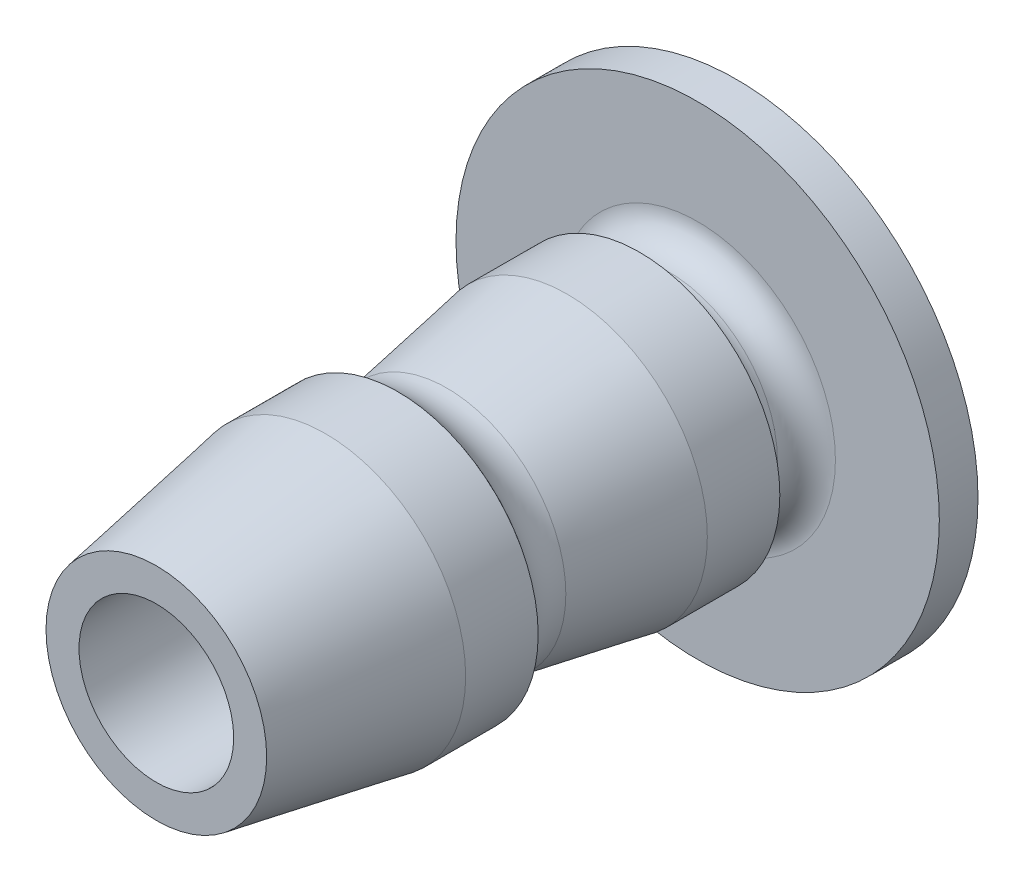
ISO-10303-21;
HEADER;
FILE_DESCRIPTION(('STEP AP214'),'2;1');
FILE_NAME('part.step','',(''),(''),'','','');
FILE_SCHEMA(('AUTOMOTIVE_DESIGN { 1 0 10303 214 1 1 1 1 }'));
ENDSEC;
DATA;
#1=APPLICATION_CONTEXT('core data for automotive mechanical design processes');
#2=APPLICATION_PROTOCOL_DEFINITION('international standard','automotive_design',2000,#1);
#3=PRODUCT_CONTEXT('',#1,'mechanical');
#4=PRODUCT('Part','Part','',(#3));
#5=PRODUCT_RELATED_PRODUCT_CATEGORY('part','',(#4));
#6=PRODUCT_DEFINITION_FORMATION('','',#4);
#7=PRODUCT_DEFINITION_CONTEXT('part definition',#1,'design');
#8=PRODUCT_DEFINITION('design','',#6,#7);
#9=PRODUCT_DEFINITION_SHAPE('','',#8);
#10=(LENGTH_UNIT() NAMED_UNIT(*) SI_UNIT(.MILLI.,.METRE.));
#11=(NAMED_UNIT(*) PLANE_ANGLE_UNIT() SI_UNIT($,.RADIAN.));
#12=(NAMED_UNIT(*) SI_UNIT($,.STERADIAN.) SOLID_ANGLE_UNIT());
#13=UNCERTAINTY_MEASURE_WITH_UNIT(LENGTH_MEASURE(1.E-05),#10,'distance_accuracy_value','');
#14=(GEOMETRIC_REPRESENTATION_CONTEXT(3) GLOBAL_UNCERTAINTY_ASSIGNED_CONTEXT((#13)) GLOBAL_UNIT_ASSIGNED_CONTEXT((#10,
#11,#12)) REPRESENTATION_CONTEXT('',''));
#15=CARTESIAN_POINT('',(0.,0.,0.));
#16=DIRECTION('',(0.,0.,1.));
#17=DIRECTION('',(1.,0.,0.));
#18=AXIS2_PLACEMENT_3D('',#15,#16,#17);
#19=CARTESIAN_POINT('',(0.,0.,0.));
#20=DIRECTION('',(0.,0.,1.));
#21=DIRECTION('',(1.,0.,0.));
#22=AXIS2_PLACEMENT_3D('',#19,#20,#21);
#23=PLANE('',#22);
#24=CARTESIAN_POINT('',(0.,0.,0.));
#25=DIRECTION('',(0.,0.,1.));
#26=DIRECTION('',(1.,0.,0.));
#27=AXIS2_PLACEMENT_3D('',#24,#25,#26);
#28=CIRCLE('',#27,2.85);
#29=CARTESIAN_POINT('',(2.85,0.,0.));
#30=VERTEX_POINT('',#29);
#31=EDGE_CURVE('E46',#30,#30,#28,.T.);
#32=ORIENTED_EDGE('',*,*,#31,.T.);
#33=EDGE_LOOP('',(#32));
#34=FACE_BOUND('',#33,.T.);
#35=CARTESIAN_POINT('',(0.,0.,0.));
#36=DIRECTION('',(0.,0.,1.));
#37=DIRECTION('',(1.,0.,0.));
#38=AXIS2_PLACEMENT_3D('',#35,#36,#37);
#39=CIRCLE('',#38,2.9);
#40=CARTESIAN_POINT('',(2.9,0.,0.));
#41=VERTEX_POINT('',#40);
#42=EDGE_CURVE('E67',#41,#41,#39,.T.);
#43=ORIENTED_EDGE('',*,*,#42,.F.);
#44=EDGE_LOOP('',(#43));
#45=FACE_BOUND('',#44,.T.);
#46=ADVANCED_FACE('F31',(#34,#45),#23,.F.);
#47=CARTESIAN_POINT('',(0.,0.,5.));
#48=DIRECTION('',(0.,0.,-1.));
#49=DIRECTION('',(-1.,0.,0.));
#50=AXIS2_PLACEMENT_3D('',#47,#48,#49);
#51=CYLINDRICAL_SURFACE('',#50,2.9);
#52=CARTESIAN_POINT('',(0.,0.,1.49999999999993));
#53=DIRECTION('',(0.,0.,1.));
#54=DIRECTION('',(1.,0.,0.));
#55=AXIS2_PLACEMENT_3D('',#52,#53,#54);
#56=CIRCLE('',#55,2.9);
#57=CARTESIAN_POINT('',(2.9,0.,1.49999999999993));
#58=VERTEX_POINT('',#57);
#59=EDGE_CURVE('E64',#58,#58,#56,.F.);
#60=ORIENTED_EDGE('',*,*,#59,.T.);
#61=EDGE_LOOP('',(#60));
#62=FACE_BOUND('',#61,.T.);
#63=ORIENTED_EDGE('',*,*,#42,.T.);
#64=EDGE_LOOP('',(#63));
#65=FACE_BOUND('',#64,.T.);
#66=ADVANCED_FACE('F106',(#62,#65),#51,.T.);
#67=CARTESIAN_POINT('',(0.,0.,5.));
#68=DIRECTION('',(0.,0.,-1.));
#69=DIRECTION('',(-1.,0.,0.));
#70=AXIS2_PLACEMENT_3D('',#67,#68,#69);
#71=CYLINDRICAL_SURFACE('',#70,1.6);
#72=CARTESIAN_POINT('',(0.,0.,-1.));
#73=DIRECTION('',(0.,0.,1.));
#74=DIRECTION('',(1.,0.,0.));
#75=AXIS2_PLACEMENT_3D('',#72,#73,#74);
#76=CIRCLE('',#75,1.6);
#77=CARTESIAN_POINT('',(1.6,0.,-1.));
#78=VERTEX_POINT('',#77);
#79=EDGE_CURVE('E10',#78,#78,#76,.F.);
#80=ORIENTED_EDGE('',*,*,#79,.T.);
#81=EDGE_LOOP('',(#80));
#82=FACE_BOUND('',#81,.T.);
#83=CARTESIAN_POINT('',(0.,0.,10.));
#84=DIRECTION('',(0.,0.,1.));
#85=DIRECTION('',(1.,0.,0.));
#86=AXIS2_PLACEMENT_3D('',#83,#84,#85);
#87=CIRCLE('',#86,1.6);
#88=CARTESIAN_POINT('',(1.6,0.,10.));
#89=VERTEX_POINT('',#88);
#90=EDGE_CURVE('E73',#89,#89,#87,.T.);
#91=ORIENTED_EDGE('',*,*,#90,.T.);
#92=EDGE_LOOP('',(#91));
#93=FACE_BOUND('',#92,.T.);
#94=ADVANCED_FACE('F112',(#82,#93),#71,.F.);
#95=CARTESIAN_POINT('',(0.,0.,5.));
#96=DIRECTION('',(0.,0.,-1.));
#97=DIRECTION('',(-1.,0.,0.));
#98=AXIS2_PLACEMENT_3D('',#95,#96,#97);
#99=CONICAL_SURFACE('',#98,2.28285556752037,0.17453292519943);
#100=CARTESIAN_POINT('',(0.,0.,3.98857033542322));
#101=DIRECTION('',(0.,0.,-1.));
#102=DIRECTION('',(-1.,0.,0.));
#103=AXIS2_PLACEMENT_3D('',#100,#101,#102);
#104=CIRCLE('',#103,2.46119790647417);
#105=CARTESIAN_POINT('',(-2.46119790647417,0.,3.98857033542322));
#106=VERTEX_POINT('',#105);
#107=EDGE_CURVE('E55',#106,#106,#104,.T.);
#108=ORIENTED_EDGE('',*,*,#107,.T.);
#109=EDGE_LOOP('',(#108));
#110=FACE_BOUND('',#109,.T.);
#111=ORIENTED_EDGE('',*,*,#59,.F.);
#112=EDGE_LOOP('',(#111));
#113=FACE_BOUND('',#112,.T.);
#114=ADVANCED_FACE('F119',(#110,#113),#99,.T.);
#115=CARTESIAN_POINT('',(0.,0.,10.));
#116=DIRECTION('',(0.,0.,1.));
#117=DIRECTION('',(1.,0.,0.));
#118=AXIS2_PLACEMENT_3D('',#115,#116,#117);
#119=PLANE('',#118);
#120=CARTESIAN_POINT('',(0.,0.,10.));
#121=DIRECTION('',(0.,0.,1.));
#122=DIRECTION('',(1.,0.,0.));
#123=AXIS2_PLACEMENT_3D('',#120,#121,#122);
#124=CIRCLE('',#123,2.28285556752038);
#125=CARTESIAN_POINT('',(2.28285556752038,0.,10.));
#126=VERTEX_POINT('',#125);
#127=EDGE_CURVE('E61',#126,#126,#124,.T.);
#128=ORIENTED_EDGE('',*,*,#127,.T.);
#129=EDGE_LOOP('',(#128));
#130=FACE_BOUND('',#129,.T.);
#131=ORIENTED_EDGE('',*,*,#90,.F.);
#132=EDGE_LOOP('',(#131));
#133=FACE_BOUND('',#132,.T.);
#134=ADVANCED_FACE('F122',(#130,#133),#119,.T.);
#135=CARTESIAN_POINT('',(0.,0.,10.));
#136=DIRECTION('',(0.,0.,-1.));
#137=DIRECTION('',(-1.,0.,0.));
#138=AXIS2_PLACEMENT_3D('',#135,#136,#137);
#139=CYLINDRICAL_SURFACE('',#138,2.9);
#140=CARTESIAN_POINT('',(0.,0.,6.49999999999997));
#141=DIRECTION('',(0.,0.,1.));
#142=DIRECTION('',(1.,0.,0.));
#143=AXIS2_PLACEMENT_3D('',#140,#141,#142);
#144=CIRCLE('',#143,2.9);
#145=CARTESIAN_POINT('',(2.9,0.,6.49999999999997));
#146=VERTEX_POINT('',#145);
#147=EDGE_CURVE('E58',#146,#146,#144,.F.);
#148=ORIENTED_EDGE('',*,*,#147,.T.);
#149=EDGE_LOOP('',(#148));
#150=FACE_BOUND('',#149,.T.);
#151=CARTESIAN_POINT('',(0.,0.,5.));
#152=DIRECTION('',(0.,0.,1.));
#153=DIRECTION('',(1.,0.,0.));
#154=AXIS2_PLACEMENT_3D('',#151,#152,#153);
#155=CIRCLE('',#154,2.9);
#156=CARTESIAN_POINT('',(2.9,0.,5.));
#157=VERTEX_POINT('',#156);
#158=EDGE_CURVE('E70',#157,#157,#155,.T.);
#159=ORIENTED_EDGE('',*,*,#158,.T.);
#160=EDGE_LOOP('',(#159));
#161=FACE_BOUND('',#160,.T.);
#162=ADVANCED_FACE('F125',(#150,#161),#139,.T.);
#163=CARTESIAN_POINT('',(0.,0.,10.));
#164=DIRECTION('',(0.,0.,-1.));
#165=DIRECTION('',(-1.,0.,0.));
#166=AXIS2_PLACEMENT_3D('',#163,#164,#165);
#167=CONICAL_SURFACE('',#166,2.28285556752038,0.17453292519943);
#168=ORIENTED_EDGE('',*,*,#147,.F.);
#169=EDGE_LOOP('',(#168));
#170=FACE_BOUND('',#169,.T.);
#171=ORIENTED_EDGE('',*,*,#127,.F.);
#172=EDGE_LOOP('',(#171));
#173=FACE_BOUND('',#172,.T.);
#174=ADVANCED_FACE('F101',(#170,#173),#167,.T.);
#175=CARTESIAN_POINT('',(0.,0.,4.16221851309015));
#176=DIRECTION('',(0.,0.,1.));
#177=DIRECTION('',(1.,0.,0.));
#178=AXIS2_PLACEMENT_3D('',#175,#176,#177);
#179=TOROIDAL_SURFACE('',#178,3.44600565948637,1.);
#180=ORIENTED_EDGE('',*,*,#107,.F.);
#181=EDGE_LOOP('',(#180));
#182=FACE_BOUND('',#181,.T.);
#183=ORIENTED_EDGE('',*,*,#158,.F.);
#184=EDGE_LOOP('',(#183));
#185=FACE_BOUND('',#184,.T.);
#186=ADVANCED_FACE('F93',(#182,#185),#179,.F.);
#187=CARTESIAN_POINT('',(0.,0.,-2.));
#188=DIRECTION('',(0.,0.,1.));
#189=DIRECTION('',(1.,0.,0.));
#190=AXIS2_PLACEMENT_3D('',#187,#188,#189);
#191=PLANE('',#190);
#192=CARTESIAN_POINT('',(0.,0.,-2.));
#193=DIRECTION('',(0.,0.,1.));
#194=DIRECTION('',(1.,0.,0.));
#195=AXIS2_PLACEMENT_3D('',#192,#193,#194);
#196=CIRCLE('',#195,2.6);
#197=CARTESIAN_POINT('',(2.6,0.,-2.));
#198=VERTEX_POINT('',#197);
#199=EDGE_CURVE('E38',#198,#198,#196,.T.);
#200=ORIENTED_EDGE('',*,*,#199,.T.);
#201=EDGE_LOOP('',(#200));
#202=FACE_BOUND('',#201,.T.);
#203=CARTESIAN_POINT('',(0.,0.,-2.));
#204=DIRECTION('',(0.,0.,1.));
#205=DIRECTION('',(1.,0.,0.));
#206=AXIS2_PLACEMENT_3D('',#203,#204,#205);
#207=CIRCLE('',#206,5.);
#208=CARTESIAN_POINT('',(5.,0.,-2.));
#209=VERTEX_POINT('',#208);
#210=EDGE_CURVE('E51',#209,#209,#207,.T.);
#211=ORIENTED_EDGE('',*,*,#210,.F.);
#212=EDGE_LOOP('',(#211));
#213=FACE_BOUND('',#212,.T.);
#214=ADVANCED_FACE('F91',(#202,#213),#191,.F.);
#215=CARTESIAN_POINT('',(0.,0.,-1.2));
#216=DIRECTION('',(0.,0.,1.));
#217=DIRECTION('',(1.,0.,0.));
#218=AXIS2_PLACEMENT_3D('',#215,#216,#217);
#219=PLANE('',#218);
#220=CARTESIAN_POINT('',(0.,0.,-1.2));
#221=DIRECTION('',(0.,0.,1.));
#222=DIRECTION('',(1.,0.,0.));
#223=AXIS2_PLACEMENT_3D('',#220,#221,#222);
#224=CIRCLE('',#223,2.85);
#225=CARTESIAN_POINT('',(2.85,0.,-1.2));
#226=VERTEX_POINT('',#225);
#227=EDGE_CURVE('E42',#226,#226,#224,.F.);
#228=ORIENTED_EDGE('',*,*,#227,.T.);
#229=EDGE_LOOP('',(#228));
#230=FACE_BOUND('',#229,.T.);
#231=CARTESIAN_POINT('',(0.,0.,-1.2));
#232=DIRECTION('',(0.,0.,1.));
#233=DIRECTION('',(1.,0.,0.));
#234=AXIS2_PLACEMENT_3D('',#231,#232,#233);
#235=CIRCLE('',#234,5.);
#236=CARTESIAN_POINT('',(5.,0.,-1.2));
#237=VERTEX_POINT('',#236);
#238=EDGE_CURVE('E76',#237,#237,#235,.T.);
#239=ORIENTED_EDGE('',*,*,#238,.T.);
#240=EDGE_LOOP('',(#239));
#241=FACE_BOUND('',#240,.T.);
#242=ADVANCED_FACE('F82',(#230,#241),#219,.T.);
#243=CARTESIAN_POINT('',(0.,0.,-1.2));
#244=DIRECTION('',(0.,0.,-1.));
#245=DIRECTION('',(-1.,0.,0.));
#246=AXIS2_PLACEMENT_3D('',#243,#244,#245);
#247=CYLINDRICAL_SURFACE('',#246,5.);
#248=ORIENTED_EDGE('',*,*,#238,.F.);
#249=EDGE_LOOP('',(#248));
#250=FACE_BOUND('',#249,.T.);
#251=ORIENTED_EDGE('',*,*,#210,.T.);
#252=EDGE_LOOP('',(#251));
#253=FACE_BOUND('',#252,.T.);
#254=ADVANCED_FACE('F84',(#250,#253),#247,.T.);
#255=CARTESIAN_POINT('',(0.,0.,-0.6));
#256=DIRECTION('',(0.,0.,1.));
#257=DIRECTION('',(1.,0.,0.));
#258=AXIS2_PLACEMENT_3D('',#255,#256,#257);
#259=TOROIDAL_SURFACE('',#258,2.85,0.6);
#260=ORIENTED_EDGE('',*,*,#227,.F.);
#261=EDGE_LOOP('',(#260));
#262=FACE_BOUND('',#261,.T.);
#263=CARTESIAN_POINT('',(0.,0.,-0.6));
#264=DIRECTION('',(0.,0.,1.));
#265=DIRECTION('',(1.,0.,0.));
#266=AXIS2_PLACEMENT_3D('',#263,#264,#265);
#267=CIRCLE('',#266,2.25);
#268=CARTESIAN_POINT('',(2.25,0.,-0.6));
#269=VERTEX_POINT('',#268);
#270=EDGE_CURVE('E49',#269,#269,#267,.T.);
#271=ORIENTED_EDGE('',*,*,#270,.F.);
#272=EDGE_LOOP('',(#271));
#273=FACE_BOUND('',#272,.T.);
#274=ADVANCED_FACE('F87',(#262,#273),#259,.F.);
#275=CARTESIAN_POINT('',(0.,0.,-0.6));
#276=DIRECTION('',(0.,0.,1.));
#277=DIRECTION('',(1.,0.,0.));
#278=AXIS2_PLACEMENT_3D('',#275,#276,#277);
#279=TOROIDAL_SURFACE('',#278,2.85,0.6);
#280=ORIENTED_EDGE('',*,*,#270,.T.);
#281=EDGE_LOOP('',(#280));
#282=FACE_BOUND('',#281,.T.);
#283=ORIENTED_EDGE('',*,*,#31,.F.);
#284=EDGE_LOOP('',(#283));
#285=FACE_BOUND('',#284,.T.);
#286=ADVANCED_FACE('F128',(#282,#285),#279,.F.);
#287=CARTESIAN_POINT('',(0.,0.,-1.));
#288=DIRECTION('',(0.,0.,1.));
#289=DIRECTION('',(1.,0.,0.));
#290=AXIS2_PLACEMENT_3D('',#287,#288,#289);
#291=TOROIDAL_SURFACE('',#290,2.6,1.);
#292=ORIENTED_EDGE('',*,*,#79,.F.);
#293=EDGE_LOOP('',(#292));
#294=FACE_BOUND('',#293,.T.);
#295=ORIENTED_EDGE('',*,*,#199,.F.);
#296=EDGE_LOOP('',(#295));
#297=FACE_BOUND('',#296,.T.);
#298=ADVANCED_FACE('F33',(#294,#297),#291,.T.);
#299=CLOSED_SHELL('',(#46,#66,#94,#114,#134,#162,#174,#186,#214,#242,#254,#274,#286,#298));
#300=MANIFOLD_SOLID_BREP('B2',#299);
#301=ADVANCED_BREP_SHAPE_REPRESENTATION('',(#18,#300),#14);
#302=SHAPE_DEFINITION_REPRESENTATION(#9,#301);
ENDSEC;
END-ISO-10303-21;
